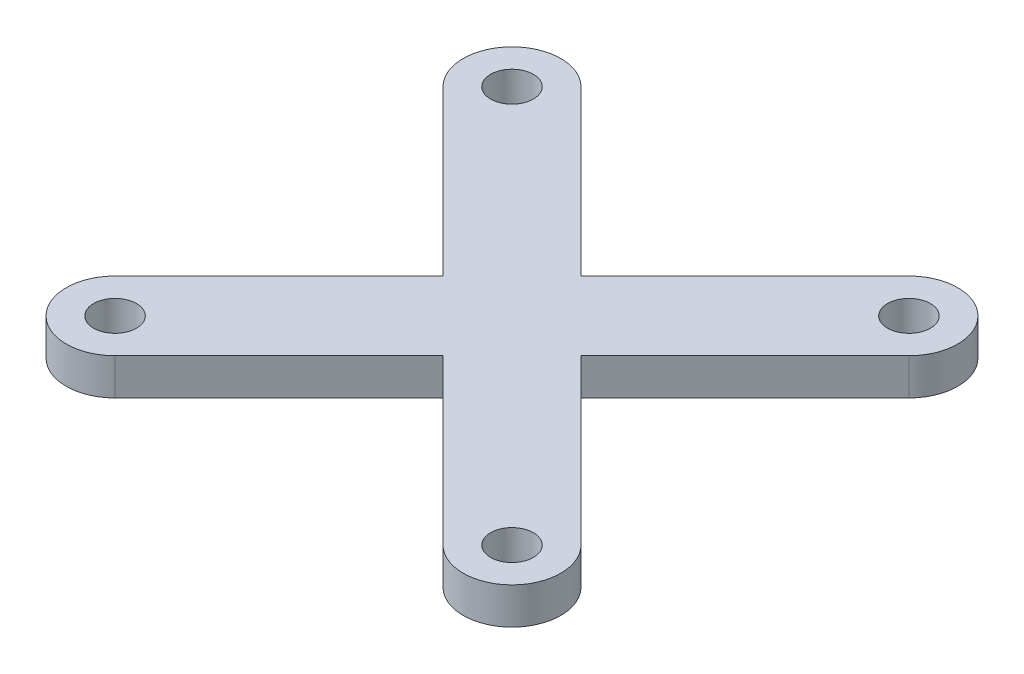
ISO-10303-21;
HEADER;
FILE_DESCRIPTION(('STEP AP214'),'2;1');
FILE_NAME('part.step','',(''),(''),'','','');
FILE_SCHEMA(('AUTOMOTIVE_DESIGN { 1 0 10303 214 1 1 1 1 }'));
ENDSEC;
DATA;
#1=APPLICATION_CONTEXT('core data for automotive mechanical design processes');
#2=APPLICATION_PROTOCOL_DEFINITION('international standard','automotive_design',2000,#1);
#3=PRODUCT_CONTEXT('',#1,'mechanical');
#4=PRODUCT('Part','Part','',(#3));
#5=PRODUCT_RELATED_PRODUCT_CATEGORY('part','',(#4));
#6=PRODUCT_DEFINITION_FORMATION('','',#4);
#7=PRODUCT_DEFINITION_CONTEXT('part definition',#1,'design');
#8=PRODUCT_DEFINITION('design','',#6,#7);
#9=PRODUCT_DEFINITION_SHAPE('','',#8);
#10=(LENGTH_UNIT() NAMED_UNIT(*) SI_UNIT(.MILLI.,.METRE.));
#11=(NAMED_UNIT(*) PLANE_ANGLE_UNIT() SI_UNIT($,.RADIAN.));
#12=(NAMED_UNIT(*) SI_UNIT($,.STERADIAN.) SOLID_ANGLE_UNIT());
#13=UNCERTAINTY_MEASURE_WITH_UNIT(LENGTH_MEASURE(1.E-05),#10,'distance_accuracy_value','');
#14=(GEOMETRIC_REPRESENTATION_CONTEXT(3) GLOBAL_UNCERTAINTY_ASSIGNED_CONTEXT((#13)) GLOBAL_UNIT_ASSIGNED_CONTEXT((#10,
#11,#12)) REPRESENTATION_CONTEXT('',''));
#15=CARTESIAN_POINT('',(0.,0.,0.));
#16=DIRECTION('',(0.,0.,1.));
#17=DIRECTION('',(1.,0.,0.));
#18=AXIS2_PLACEMENT_3D('',#15,#16,#17);
#19=CARTESIAN_POINT('',(-16.2634559672906,12.,-16.2634559672906));
#20=DIRECTION('',(0.,1.,0.));
#21=DIRECTION('',(0.,0.,1.));
#22=AXIS2_PLACEMENT_3D('',#19,#20,#21);
#23=CYLINDRICAL_SURFACE('',#22,1.755);
#24=CARTESIAN_POINT('',(-16.2634559672906,18.,-16.2634559672906));
#25=DIRECTION('',(0.,1.,0.));
#26=DIRECTION('',(0.,0.,1.));
#27=AXIS2_PLACEMENT_3D('',#24,#25,#26);
#28=CIRCLE('',#27,1.755);
#29=CARTESIAN_POINT('',(-16.2634559672906,18.,-14.5084559672906));
#30=VERTEX_POINT('',#29);
#31=EDGE_CURVE('E231',#30,#30,#28,.T.);
#32=ORIENTED_EDGE('',*,*,#31,.T.);
#33=EDGE_LOOP('',(#32));
#34=FACE_BOUND('',#33,.T.);
#35=CARTESIAN_POINT('',(-16.2634559672906,15.,-16.2634559672906));
#36=DIRECTION('',(0.,-1.,0.));
#37=DIRECTION('',(0.,0.,-1.));
#38=AXIS2_PLACEMENT_3D('',#35,#36,#37);
#39=CIRCLE('',#38,1.755);
#40=CARTESIAN_POINT('',(-16.2634559672906,15.,-18.0184559672906));
#41=VERTEX_POINT('',#40);
#42=EDGE_CURVE('E281',#41,#41,#39,.F.);
#43=ORIENTED_EDGE('',*,*,#42,.F.);
#44=EDGE_LOOP('',(#43));
#45=FACE_BOUND('',#44,.T.);
#46=ADVANCED_FACE('F41',(#34,#45),#23,.F.);
#47=CARTESIAN_POINT('',(-16.2634559672906,12.,16.2634559672909));
#48=DIRECTION('',(0.,1.,0.));
#49=DIRECTION('',(0.,0.,1.));
#50=AXIS2_PLACEMENT_3D('',#47,#48,#49);
#51=CYLINDRICAL_SURFACE('',#50,1.755);
#52=CARTESIAN_POINT('',(-16.2634559672906,18.,16.2634559672909));
#53=DIRECTION('',(0.,1.,0.));
#54=DIRECTION('',(0.,0.,1.));
#55=AXIS2_PLACEMENT_3D('',#52,#53,#54);
#56=CIRCLE('',#55,1.755);
#57=CARTESIAN_POINT('',(-16.2634559672906,18.,18.0184559672909));
#58=VERTEX_POINT('',#57);
#59=EDGE_CURVE('E283',#58,#58,#56,.T.);
#60=ORIENTED_EDGE('',*,*,#59,.T.);
#61=EDGE_LOOP('',(#60));
#62=FACE_BOUND('',#61,.T.);
#63=CARTESIAN_POINT('',(-16.2634559672906,15.,16.2634559672909));
#64=DIRECTION('',(0.,-1.,0.));
#65=DIRECTION('',(0.,0.,-1.));
#66=AXIS2_PLACEMENT_3D('',#63,#64,#65);
#67=CIRCLE('',#66,1.755);
#68=CARTESIAN_POINT('',(-16.2634559672906,15.,14.5084559672909));
#69=VERTEX_POINT('',#68);
#70=EDGE_CURVE('E284',#69,#69,#67,.F.);
#71=ORIENTED_EDGE('',*,*,#70,.F.);
#72=EDGE_LOOP('',(#71));
#73=FACE_BOUND('',#72,.T.);
#74=ADVANCED_FACE('F269',(#62,#73),#51,.F.);
#75=CARTESIAN_POINT('',(16.2634559672906,12.,-16.2634559672906));
#76=DIRECTION('',(0.,1.,0.));
#77=DIRECTION('',(0.,0.,1.));
#78=AXIS2_PLACEMENT_3D('',#75,#76,#77);
#79=CYLINDRICAL_SURFACE('',#78,1.755);
#80=CARTESIAN_POINT('',(16.2634559672906,18.,-16.2634559672906));
#81=DIRECTION('',(0.,1.,0.));
#82=DIRECTION('',(0.,0.,1.));
#83=AXIS2_PLACEMENT_3D('',#80,#81,#82);
#84=CIRCLE('',#83,1.755);
#85=CARTESIAN_POINT('',(16.2634559672906,18.,-14.5084559672906));
#86=VERTEX_POINT('',#85);
#87=EDGE_CURVE('E296',#86,#86,#84,.T.);
#88=ORIENTED_EDGE('',*,*,#87,.T.);
#89=EDGE_LOOP('',(#88));
#90=FACE_BOUND('',#89,.T.);
#91=CARTESIAN_POINT('',(16.2634559672906,15.,-16.2634559672906));
#92=DIRECTION('',(0.,-1.,0.));
#93=DIRECTION('',(0.,0.,-1.));
#94=AXIS2_PLACEMENT_3D('',#91,#92,#93);
#95=CIRCLE('',#94,1.755);
#96=CARTESIAN_POINT('',(16.2634559672906,15.,-18.0184559672906));
#97=VERTEX_POINT('',#96);
#98=EDGE_CURVE('E290',#97,#97,#95,.F.);
#99=ORIENTED_EDGE('',*,*,#98,.F.);
#100=EDGE_LOOP('',(#99));
#101=FACE_BOUND('',#100,.T.);
#102=ADVANCED_FACE('F274',(#90,#101),#79,.F.);
#103=CARTESIAN_POINT('',(16.2634559672906,12.,16.2634559672906));
#104=DIRECTION('',(0.,1.,0.));
#105=DIRECTION('',(0.,0.,1.));
#106=AXIS2_PLACEMENT_3D('',#103,#104,#105);
#107=CYLINDRICAL_SURFACE('',#106,1.755);
#108=CARTESIAN_POINT('',(16.2634559672906,18.,16.2634559672906));
#109=DIRECTION('',(0.,1.,0.));
#110=DIRECTION('',(0.,0.,1.));
#111=AXIS2_PLACEMENT_3D('',#108,#109,#110);
#112=CIRCLE('',#111,1.755);
#113=CARTESIAN_POINT('',(16.2634559672906,18.,18.0184559672906));
#114=VERTEX_POINT('',#113);
#115=EDGE_CURVE('E287',#114,#114,#112,.T.);
#116=ORIENTED_EDGE('',*,*,#115,.T.);
#117=EDGE_LOOP('',(#116));
#118=FACE_BOUND('',#117,.T.);
#119=CARTESIAN_POINT('',(16.2634559672906,15.,16.2634559672906));
#120=DIRECTION('',(0.,-1.,0.));
#121=DIRECTION('',(0.,0.,-1.));
#122=AXIS2_PLACEMENT_3D('',#119,#120,#121);
#123=CIRCLE('',#122,1.755);
#124=CARTESIAN_POINT('',(16.2634559672906,15.,14.5084559672906));
#125=VERTEX_POINT('',#124);
#126=EDGE_CURVE('E328',#125,#125,#123,.F.);
#127=ORIENTED_EDGE('',*,*,#126,.F.);
#128=EDGE_LOOP('',(#127));
#129=FACE_BOUND('',#128,.T.);
#130=ADVANCED_FACE('F312',(#118,#129),#107,.F.);
#131=CARTESIAN_POINT('',(-16.2634559672906,12.,-16.2634559672906));
#132=DIRECTION('',(0.,1.,0.));
#133=DIRECTION('',(0.,0.,1.));
#134=AXIS2_PLACEMENT_3D('',#131,#132,#133);
#135=CYLINDRICAL_SURFACE('',#134,4.);
#136=DIRECTION('',(0.,-1.,0.));
#137=VECTOR('',#136,1.);
#138=CARTESIAN_POINT('',(-13.4350288425444,18.,-19.0918830920368));
#139=LINE('',#138,#137);
#140=CARTESIAN_POINT('',(-13.4350288425444,18.,-19.0918830920368));
#141=VERTEX_POINT('',#140);
#142=CARTESIAN_POINT('',(-13.4350288425444,15.,-19.0918830920368));
#143=VERTEX_POINT('',#142);
#144=EDGE_CURVE('E151',#141,#143,#139,.T.);
#145=ORIENTED_EDGE('',*,*,#144,.T.);
#146=CARTESIAN_POINT('',(-16.2634559672906,15.,-16.2634559672906));
#147=DIRECTION('',(0.,1.,0.));
#148=DIRECTION('',(0.,0.,1.));
#149=AXIS2_PLACEMENT_3D('',#146,#147,#148);
#150=CIRCLE('',#149,3.99999999999999);
#151=CARTESIAN_POINT('',(-19.0918830920367,15.,-13.4350288425444));
#152=VERTEX_POINT('',#151);
#153=EDGE_CURVE('E58',#143,#152,#150,.T.);
#154=ORIENTED_EDGE('',*,*,#153,.T.);
#155=DIRECTION('',(0.,-1.,0.));
#156=VECTOR('',#155,1.);
#157=CARTESIAN_POINT('',(-19.0918830920367,18.,-13.4350288425444));
#158=LINE('',#157,#156);
#159=CARTESIAN_POINT('',(-19.0918830920367,18.,-13.4350288425444));
#160=VERTEX_POINT('',#159);
#161=EDGE_CURVE('E180',#160,#152,#158,.T.);
#162=ORIENTED_EDGE('',*,*,#161,.F.);
#163=CARTESIAN_POINT('',(-16.2634559672906,18.,-16.2634559672906));
#164=DIRECTION('',(0.,1.,0.));
#165=DIRECTION('',(0.,0.,1.));
#166=AXIS2_PLACEMENT_3D('',#163,#164,#165);
#167=CIRCLE('',#166,3.99999999999999);
#168=EDGE_CURVE('E138',#141,#160,#167,.T.);
#169=ORIENTED_EDGE('',*,*,#168,.F.);
#170=EDGE_LOOP('',(#145,#154,#162,#169));
#171=FACE_BOUND('',#170,.T.);
#172=ADVANCED_FACE('F266',(#171),#135,.T.);
#173=CARTESIAN_POINT('',(16.2634559672906,12.,-16.2634559672906));
#174=DIRECTION('',(0.,1.,0.));
#175=DIRECTION('',(0.,0.,1.));
#176=AXIS2_PLACEMENT_3D('',#173,#174,#175);
#177=CYLINDRICAL_SURFACE('',#176,4.);
#178=DIRECTION('',(0.,-1.,0.));
#179=VECTOR('',#178,1.);
#180=CARTESIAN_POINT('',(19.0918830920369,18.,-13.4350288425443));
#181=LINE('',#180,#179);
#182=CARTESIAN_POINT('',(19.0918830920369,18.,-13.4350288425443));
#183=VERTEX_POINT('',#182);
#184=CARTESIAN_POINT('',(19.0918830920369,15.,-13.4350288425443));
#185=VERTEX_POINT('',#184);
#186=EDGE_CURVE('E153',#183,#185,#181,.T.);
#187=ORIENTED_EDGE('',*,*,#186,.T.);
#188=CARTESIAN_POINT('',(16.2634559672906,15.,-16.2634559672906));
#189=DIRECTION('',(0.,1.,0.));
#190=DIRECTION('',(0.,0.,-1.));
#191=AXIS2_PLACEMENT_3D('',#188,#189,#190);
#192=CIRCLE('',#191,4.00000000000013);
#193=CARTESIAN_POINT('',(13.4350288425443,15.,-19.0918830920369));
#194=VERTEX_POINT('',#193);
#195=EDGE_CURVE('E12',#185,#194,#192,.T.);
#196=ORIENTED_EDGE('',*,*,#195,.T.);
#197=DIRECTION('',(0.,-1.,0.));
#198=VECTOR('',#197,1.);
#199=CARTESIAN_POINT('',(13.4350288425443,18.,-19.0918830920369));
#200=LINE('',#199,#198);
#201=CARTESIAN_POINT('',(13.4350288425443,18.,-19.0918830920369));
#202=VERTEX_POINT('',#201);
#203=EDGE_CURVE('E147',#202,#194,#200,.T.);
#204=ORIENTED_EDGE('',*,*,#203,.F.);
#205=CARTESIAN_POINT('',(16.2634559672906,18.,-16.2634559672906));
#206=DIRECTION('',(0.,1.,0.));
#207=DIRECTION('',(0.,0.,-1.));
#208=AXIS2_PLACEMENT_3D('',#205,#206,#207);
#209=CIRCLE('',#208,4.00000000000013);
#210=EDGE_CURVE('E222',#183,#202,#209,.T.);
#211=ORIENTED_EDGE('',*,*,#210,.F.);
#212=EDGE_LOOP('',(#187,#196,#204,#211));
#213=FACE_BOUND('',#212,.T.);
#214=ADVANCED_FACE('F248',(#213),#177,.T.);
#215=CARTESIAN_POINT('',(16.2634559672906,12.,16.2634559672906));
#216=DIRECTION('',(0.,1.,0.));
#217=DIRECTION('',(0.,0.,1.));
#218=AXIS2_PLACEMENT_3D('',#215,#216,#217);
#219=CYLINDRICAL_SURFACE('',#218,4.);
#220=DIRECTION('',(0.,-1.,0.));
#221=VECTOR('',#220,1.);
#222=CARTESIAN_POINT('',(13.4350288425448,18.,19.0918830920365));
#223=LINE('',#222,#221);
#224=CARTESIAN_POINT('',(13.4350288425448,18.,19.0918830920365));
#225=VERTEX_POINT('',#224);
#226=CARTESIAN_POINT('',(13.4350288425448,15.,19.0918830920365));
#227=VERTEX_POINT('',#226);
#228=EDGE_CURVE('E165',#225,#227,#223,.T.);
#229=ORIENTED_EDGE('',*,*,#228,.T.);
#230=CARTESIAN_POINT('',(16.2634559672906,15.,16.2634559672906));
#231=DIRECTION('',(0.,1.,0.));
#232=DIRECTION('',(0.,0.,-1.));
#233=AXIS2_PLACEMENT_3D('',#230,#231,#232);
#234=CIRCLE('',#233,3.99999999999951);
#235=CARTESIAN_POINT('',(19.0918830920364,15.,13.4350288425447));
#236=VERTEX_POINT('',#235);
#237=EDGE_CURVE('E50',#227,#236,#234,.T.);
#238=ORIENTED_EDGE('',*,*,#237,.T.);
#239=DIRECTION('',(0.,-1.,0.));
#240=VECTOR('',#239,1.);
#241=CARTESIAN_POINT('',(19.0918830920364,18.,13.4350288425447));
#242=LINE('',#241,#240);
#243=CARTESIAN_POINT('',(19.0918830920364,18.,13.4350288425447));
#244=VERTEX_POINT('',#243);
#245=EDGE_CURVE('E162',#244,#236,#242,.T.);
#246=ORIENTED_EDGE('',*,*,#245,.F.);
#247=CARTESIAN_POINT('',(16.2634559672906,18.,16.2634559672906));
#248=DIRECTION('',(0.,1.,0.));
#249=DIRECTION('',(0.,0.,-1.));
#250=AXIS2_PLACEMENT_3D('',#247,#248,#249);
#251=CIRCLE('',#250,3.99999999999951);
#252=EDGE_CURVE('E211',#225,#244,#251,.T.);
#253=ORIENTED_EDGE('',*,*,#252,.F.);
#254=EDGE_LOOP('',(#229,#238,#246,#253));
#255=FACE_BOUND('',#254,.T.);
#256=ADVANCED_FACE('F258',(#255),#219,.T.);
#257=CARTESIAN_POINT('',(-16.2634559672906,12.,16.2634559672909));
#258=DIRECTION('',(0.,1.,0.));
#259=DIRECTION('',(0.,0.,1.));
#260=AXIS2_PLACEMENT_3D('',#257,#258,#259);
#261=CYLINDRICAL_SURFACE('',#260,4.);
#262=DIRECTION('',(0.,-1.,0.));
#263=VECTOR('',#262,1.);
#264=CARTESIAN_POINT('',(-19.0918830920367,18.,13.4350288425447));
#265=LINE('',#264,#263);
#266=CARTESIAN_POINT('',(-19.0918830920367,18.,13.4350288425447));
#267=VERTEX_POINT('',#266);
#268=CARTESIAN_POINT('',(-19.0918830920368,15.,13.4350288425447));
#269=VERTEX_POINT('',#268);
#270=EDGE_CURVE('E174',#267,#269,#265,.T.);
#271=ORIENTED_EDGE('',*,*,#270,.T.);
#272=CARTESIAN_POINT('',(-16.2634559672906,15.,16.2634559672909));
#273=DIRECTION('',(0.,1.,0.));
#274=DIRECTION('',(0.,0.,1.));
#275=AXIS2_PLACEMENT_3D('',#272,#273,#274);
#276=CIRCLE('',#275,3.99999999999993);
#277=CARTESIAN_POINT('',(-13.4350288425444,15.,19.091883092037));
#278=VERTEX_POINT('',#277);
#279=EDGE_CURVE('E44',#269,#278,#276,.T.);
#280=ORIENTED_EDGE('',*,*,#279,.T.);
#281=DIRECTION('',(0.,-1.,0.));
#282=VECTOR('',#281,1.);
#283=CARTESIAN_POINT('',(-13.4350288425444,18.,19.091883092037));
#284=LINE('',#283,#282);
#285=CARTESIAN_POINT('',(-13.4350288425444,18.,19.091883092037));
#286=VERTEX_POINT('',#285);
#287=EDGE_CURVE('E171',#286,#278,#284,.T.);
#288=ORIENTED_EDGE('',*,*,#287,.F.);
#289=CARTESIAN_POINT('',(-16.2634559672906,18.,16.2634559672909));
#290=DIRECTION('',(0.,1.,0.));
#291=DIRECTION('',(0.,0.,1.));
#292=AXIS2_PLACEMENT_3D('',#289,#290,#291);
#293=CIRCLE('',#292,3.99999999999993);
#294=EDGE_CURVE('E209',#267,#286,#293,.T.);
#295=ORIENTED_EDGE('',*,*,#294,.F.);
#296=EDGE_LOOP('',(#271,#280,#288,#295));
#297=FACE_BOUND('',#296,.T.);
#298=ADVANCED_FACE('F196',(#297),#261,.T.);
#299=CARTESIAN_POINT('',(-16.2634559672906,18.,-16.2634559672906));
#300=DIRECTION('',(0.,1.,0.));
#301=DIRECTION('',(0.,0.,1.));
#302=AXIS2_PLACEMENT_3D('',#299,#300,#301);
#303=PLANE('',#302);
#304=ORIENTED_EDGE('',*,*,#115,.F.);
#305=EDGE_LOOP('',(#304));
#306=FACE_BOUND('',#305,.T.);
#307=ORIENTED_EDGE('',*,*,#31,.F.);
#308=EDGE_LOOP('',(#307));
#309=FACE_BOUND('',#308,.T.);
#310=ORIENTED_EDGE('',*,*,#168,.T.);
#311=DIRECTION('',(0.707106781186555,0.,0.70710678118654));
#312=VECTOR('',#311,1.);
#313=CARTESIAN_POINT('',(-19.0918830920367,18.,-13.4350288425444));
#314=LINE('',#313,#312);
#315=CARTESIAN_POINT('',(-5.65685424949216,18.,0.));
#316=VERTEX_POINT('',#315);
#317=EDGE_CURVE('E301',#160,#316,#314,.T.);
#318=ORIENTED_EDGE('',*,*,#317,.T.);
#319=DIRECTION('',(-0.707106781186542,0.,0.707106781186554));
#320=VECTOR('',#319,1.);
#321=CARTESIAN_POINT('',(-5.65685424949216,18.,0.));
#322=LINE('',#321,#320);
#323=EDGE_CURVE('E213',#316,#267,#322,.T.);
#324=ORIENTED_EDGE('',*,*,#323,.T.);
#325=ORIENTED_EDGE('',*,*,#294,.T.);
#326=DIRECTION('',(0.707106781186548,0.,-0.707106781186547));
#327=VECTOR('',#326,1.);
#328=CARTESIAN_POINT('',(-13.4350288425444,18.,19.091883092037));
#329=LINE('',#328,#327);
#330=CARTESIAN_POINT('',(3.00974523081976E-13,18.,5.65685424949227));
#331=VERTEX_POINT('',#330);
#332=EDGE_CURVE('E206',#286,#331,#329,.T.);
#333=ORIENTED_EDGE('',*,*,#332,.T.);
#334=DIRECTION('',(0.707106781186555,0.,0.70710678118654));
#335=VECTOR('',#334,1.);
#336=CARTESIAN_POINT('',(3.00974523081976E-13,18.,5.65685424949227));
#337=LINE('',#336,#335);
#338=EDGE_CURVE('E208',#331,#225,#337,.T.);
#339=ORIENTED_EDGE('',*,*,#338,.T.);
#340=ORIENTED_EDGE('',*,*,#252,.T.);
#341=DIRECTION('',(-0.70710678118653,0.,-0.707106781186565));
#342=VECTOR('',#341,1.);
#343=CARTESIAN_POINT('',(5.65685424949258,18.,2.18575157973078E-13));
#344=LINE('',#343,#342);
#345=CARTESIAN_POINT('',(5.65685424949258,18.,2.18575157973078E-13));
#346=VERTEX_POINT('',#345);
#347=EDGE_CURVE('E218',#244,#346,#344,.T.);
#348=ORIENTED_EDGE('',*,*,#347,.T.);
#349=DIRECTION('',(0.707106781186541,0.,-0.707106781186554));
#350=VECTOR('',#349,1.);
#351=CARTESIAN_POINT('',(19.0918830920369,18.,-13.4350288425443));
#352=LINE('',#351,#350);
#353=EDGE_CURVE('E220',#346,#183,#352,.T.);
#354=ORIENTED_EDGE('',*,*,#353,.T.);
#355=ORIENTED_EDGE('',*,*,#210,.T.);
#356=DIRECTION('',(-0.707106781186541,0.,0.707106781186554));
#357=VECTOR('',#356,1.);
#358=CARTESIAN_POINT('',(-1.27502175484295E-13,18.,-5.65685424949221));
#359=LINE('',#358,#357);
#360=CARTESIAN_POINT('',(-1.27502175484295E-13,18.,-5.65685424949221));
#361=VERTEX_POINT('',#360);
#362=EDGE_CURVE('E224',#202,#361,#359,.T.);
#363=ORIENTED_EDGE('',*,*,#362,.T.);
#364=DIRECTION('',(-0.70710678118654,0.,-0.707106781186555));
#365=VECTOR('',#364,1.);
#366=CARTESIAN_POINT('',(-13.4350288425444,18.,-19.0918830920368));
#367=LINE('',#366,#365);
#368=EDGE_CURVE('E66',#361,#141,#367,.T.);
#369=ORIENTED_EDGE('',*,*,#368,.T.);
#370=EDGE_LOOP('',(#310,#318,#324,#325,#333,#339,#340,#348,#354,#355,#363,#369));
#371=FACE_BOUND('',#370,.T.);
#372=ORIENTED_EDGE('',*,*,#87,.F.);
#373=EDGE_LOOP('',(#372));
#374=FACE_BOUND('',#373,.T.);
#375=ORIENTED_EDGE('',*,*,#59,.F.);
#376=EDGE_LOOP('',(#375));
#377=FACE_BOUND('',#376,.T.);
#378=ADVANCED_FACE('F249',(#306,#309,#371,#374,#377),#303,.T.);
#379=CARTESIAN_POINT('',(-19.0918830920367,18.,-13.4350288425444));
#380=DIRECTION('',(0.70710678118654,0.,-0.707106781186555));
#381=DIRECTION('',(-0.707106781186555,0.,-0.70710678118654));
#382=AXIS2_PLACEMENT_3D('',#379,#380,#381);
#383=PLANE('',#382);
#384=DIRECTION('',(0.707106781186555,0.,0.70710678118654));
#385=VECTOR('',#384,1.);
#386=CARTESIAN_POINT('',(-19.0918830920367,15.,-13.4350288425444));
#387=LINE('',#386,#385);
#388=CARTESIAN_POINT('',(-5.65685424949216,15.,0.));
#389=VERTEX_POINT('',#388);
#390=EDGE_CURVE('E227',#152,#389,#387,.T.);
#391=ORIENTED_EDGE('',*,*,#390,.T.);
#392=DIRECTION('',(0.,-1.,0.));
#393=VECTOR('',#392,1.);
#394=CARTESIAN_POINT('',(-5.65685424949216,18.,0.));
#395=LINE('',#394,#393);
#396=EDGE_CURVE('E177',#316,#389,#395,.T.);
#397=ORIENTED_EDGE('',*,*,#396,.F.);
#398=ORIENTED_EDGE('',*,*,#317,.F.);
#399=ORIENTED_EDGE('',*,*,#161,.T.);
#400=EDGE_LOOP('',(#391,#397,#398,#399));
#401=FACE_BOUND('',#400,.T.);
#402=ADVANCED_FACE('F307',(#401),#383,.F.);
#403=CARTESIAN_POINT('',(-5.65685424949216,18.,0.));
#404=DIRECTION('',(0.707106781186553,0.,0.707106781186541));
#405=DIRECTION('',(0.707106781186542,0.,-0.707106781186554));
#406=AXIS2_PLACEMENT_3D('',#403,#404,#405);
#407=PLANE('',#406);
#408=DIRECTION('',(-0.707106781186542,0.,0.707106781186554));
#409=VECTOR('',#408,1.);
#410=CARTESIAN_POINT('',(-5.65685424949216,15.,0.));
#411=LINE('',#410,#409);
#412=EDGE_CURVE('E230',#389,#269,#411,.T.);
#413=ORIENTED_EDGE('',*,*,#412,.T.);
#414=ORIENTED_EDGE('',*,*,#270,.F.);
#415=ORIENTED_EDGE('',*,*,#323,.F.);
#416=ORIENTED_EDGE('',*,*,#396,.T.);
#417=EDGE_LOOP('',(#413,#414,#415,#416));
#418=FACE_BOUND('',#417,.T.);
#419=ADVANCED_FACE('F305',(#418),#407,.F.);
#420=CARTESIAN_POINT('',(-13.4350288425444,18.,19.091883092037));
#421=DIRECTION('',(-0.707106781186547,0.,-0.707106781186548));
#422=DIRECTION('',(-0.707106781186548,0.,0.707106781186547));
#423=AXIS2_PLACEMENT_3D('',#420,#421,#422);
#424=PLANE('',#423);
#425=DIRECTION('',(0.707106781186548,0.,-0.707106781186547));
#426=VECTOR('',#425,1.);
#427=CARTESIAN_POINT('',(-13.4350288425444,15.,19.091883092037));
#428=LINE('',#427,#426);
#429=CARTESIAN_POINT('',(3.01271458304254E-13,15.,5.65685424949227));
#430=VERTEX_POINT('',#429);
#431=EDGE_CURVE('E205',#278,#430,#428,.T.);
#432=ORIENTED_EDGE('',*,*,#431,.T.);
#433=DIRECTION('',(0.,-1.,0.));
#434=VECTOR('',#433,1.);
#435=CARTESIAN_POINT('',(3.00974523081976E-13,18.,5.65685424949227));
#436=LINE('',#435,#434);
#437=EDGE_CURVE('E168',#331,#430,#436,.T.);
#438=ORIENTED_EDGE('',*,*,#437,.F.);
#439=ORIENTED_EDGE('',*,*,#332,.F.);
#440=ORIENTED_EDGE('',*,*,#287,.T.);
#441=EDGE_LOOP('',(#432,#438,#439,#440));
#442=FACE_BOUND('',#441,.T.);
#443=ADVANCED_FACE('F203',(#442),#424,.F.);
#444=CARTESIAN_POINT('',(3.00974523081976E-13,18.,5.65685424949227));
#445=DIRECTION('',(0.70710678118654,0.,-0.707106781186555));
#446=DIRECTION('',(-0.707106781186555,0.,-0.70710678118654));
#447=AXIS2_PLACEMENT_3D('',#444,#445,#446);
#448=PLANE('',#447);
#449=DIRECTION('',(0.707106781186555,0.,0.70710678118654));
#450=VECTOR('',#449,1.);
#451=CARTESIAN_POINT('',(3.00974523081976E-13,15.,5.65685424949227));
#452=LINE('',#451,#450);
#453=EDGE_CURVE('E234',#430,#227,#452,.T.);
#454=ORIENTED_EDGE('',*,*,#453,.T.);
#455=ORIENTED_EDGE('',*,*,#228,.F.);
#456=ORIENTED_EDGE('',*,*,#338,.F.);
#457=ORIENTED_EDGE('',*,*,#437,.T.);
#458=EDGE_LOOP('',(#454,#455,#456,#457));
#459=FACE_BOUND('',#458,.T.);
#460=ADVANCED_FACE('F257',(#459),#448,.F.);
#461=CARTESIAN_POINT('',(5.65685424949258,18.,2.18575157973078E-13));
#462=DIRECTION('',(-0.707106781186565,0.,0.70710678118653));
#463=DIRECTION('',(0.70710678118653,0.,0.707106781186565));
#464=AXIS2_PLACEMENT_3D('',#461,#462,#463);
#465=PLANE('',#464);
#466=DIRECTION('',(-0.70710678118653,0.,-0.707106781186565));
#467=VECTOR('',#466,1.);
#468=CARTESIAN_POINT('',(5.65685424949258,15.,2.18575157973078E-13));
#469=LINE('',#468,#467);
#470=CARTESIAN_POINT('',(5.65685424949258,15.,2.16840434497101E-13));
#471=VERTEX_POINT('',#470);
#472=EDGE_CURVE('E237',#236,#471,#469,.T.);
#473=ORIENTED_EDGE('',*,*,#472,.T.);
#474=DIRECTION('',(0.,-1.,0.));
#475=VECTOR('',#474,1.);
#476=CARTESIAN_POINT('',(5.65685424949258,18.,2.18575157973078E-13));
#477=LINE('',#476,#475);
#478=EDGE_CURVE('E159',#346,#471,#477,.T.);
#479=ORIENTED_EDGE('',*,*,#478,.F.);
#480=ORIENTED_EDGE('',*,*,#347,.F.);
#481=ORIENTED_EDGE('',*,*,#245,.T.);
#482=EDGE_LOOP('',(#473,#479,#480,#481));
#483=FACE_BOUND('',#482,.T.);
#484=ADVANCED_FACE('F254',(#483),#465,.F.);
#485=CARTESIAN_POINT('',(19.0918830920369,18.,-13.4350288425443));
#486=DIRECTION('',(-0.707106781186553,0.,-0.707106781186541));
#487=DIRECTION('',(-0.707106781186542,0.,0.707106781186554));
#488=AXIS2_PLACEMENT_3D('',#485,#486,#487);
#489=PLANE('',#488);
#490=DIRECTION('',(0.707106781186541,0.,-0.707106781186554));
#491=VECTOR('',#490,1.);
#492=CARTESIAN_POINT('',(19.0918830920369,15.,-13.4350288425443));
#493=LINE('',#492,#491);
#494=EDGE_CURVE('E148',#471,#185,#493,.T.);
#495=ORIENTED_EDGE('',*,*,#494,.T.);
#496=ORIENTED_EDGE('',*,*,#186,.F.);
#497=ORIENTED_EDGE('',*,*,#353,.F.);
#498=ORIENTED_EDGE('',*,*,#478,.T.);
#499=EDGE_LOOP('',(#495,#496,#497,#498));
#500=FACE_BOUND('',#499,.T.);
#501=ADVANCED_FACE('F243',(#500),#489,.F.);
#502=CARTESIAN_POINT('',(-1.27502175484295E-13,18.,-5.65685424949221));
#503=DIRECTION('',(0.707106781186554,0.,0.707106781186541));
#504=DIRECTION('',(0.707106781186541,0.,-0.707106781186554));
#505=AXIS2_PLACEMENT_3D('',#502,#503,#504);
#506=PLANE('',#505);
#507=DIRECTION('',(-0.707106781186541,0.,0.707106781186554));
#508=VECTOR('',#507,1.);
#509=CARTESIAN_POINT('',(-1.27502175484295E-13,15.,-5.65685424949221));
#510=LINE('',#509,#508);
#511=CARTESIAN_POINT('',(-1.28369537222284E-13,15.,-5.65685424949221));
#512=VERTEX_POINT('',#511);
#513=EDGE_CURVE('E134',#194,#512,#510,.T.);
#514=ORIENTED_EDGE('',*,*,#513,.T.);
#515=DIRECTION('',(0.,-1.,0.));
#516=VECTOR('',#515,1.);
#517=CARTESIAN_POINT('',(-1.27502175484295E-13,18.,-5.65685424949221));
#518=LINE('',#517,#516);
#519=EDGE_CURVE('E145',#361,#512,#518,.T.);
#520=ORIENTED_EDGE('',*,*,#519,.F.);
#521=ORIENTED_EDGE('',*,*,#362,.F.);
#522=ORIENTED_EDGE('',*,*,#203,.T.);
#523=EDGE_LOOP('',(#514,#520,#521,#522));
#524=FACE_BOUND('',#523,.T.);
#525=ADVANCED_FACE('F143',(#524),#506,.F.);
#526=CARTESIAN_POINT('',(-13.4350288425444,18.,-19.0918830920368));
#527=DIRECTION('',(-0.707106781186555,0.,0.70710678118654));
#528=DIRECTION('',(0.70710678118654,0.,0.707106781186555));
#529=AXIS2_PLACEMENT_3D('',#526,#527,#528);
#530=PLANE('',#529);
#531=DIRECTION('',(-0.70710678118654,0.,-0.707106781186555));
#532=VECTOR('',#531,1.);
#533=CARTESIAN_POINT('',(-13.4350288425444,15.,-19.0918830920368));
#534=LINE('',#533,#532);
#535=EDGE_CURVE('E130',#512,#143,#534,.T.);
#536=ORIENTED_EDGE('',*,*,#535,.T.);
#537=ORIENTED_EDGE('',*,*,#144,.F.);
#538=ORIENTED_EDGE('',*,*,#368,.F.);
#539=ORIENTED_EDGE('',*,*,#519,.T.);
#540=EDGE_LOOP('',(#536,#537,#538,#539));
#541=FACE_BOUND('',#540,.T.);
#542=ADVANCED_FACE('F150',(#541),#530,.F.);
#543=CARTESIAN_POINT('',(-23.2567496769519,15.,36.2634559672907));
#544=DIRECTION('',(0.,-1.,0.));
#545=DIRECTION('',(0.,0.,-1.));
#546=AXIS2_PLACEMENT_3D('',#543,#544,#545);
#547=PLANE('',#546);
#548=ORIENTED_EDGE('',*,*,#70,.T.);
#549=EDGE_LOOP('',(#548));
#550=FACE_BOUND('',#549,.T.);
#551=ORIENTED_EDGE('',*,*,#126,.T.);
#552=EDGE_LOOP('',(#551));
#553=FACE_BOUND('',#552,.T.);
#554=ORIENTED_EDGE('',*,*,#153,.F.);
#555=ORIENTED_EDGE('',*,*,#535,.F.);
#556=ORIENTED_EDGE('',*,*,#513,.F.);
#557=ORIENTED_EDGE('',*,*,#195,.F.);
#558=ORIENTED_EDGE('',*,*,#494,.F.);
#559=ORIENTED_EDGE('',*,*,#472,.F.);
#560=ORIENTED_EDGE('',*,*,#237,.F.);
#561=ORIENTED_EDGE('',*,*,#453,.F.);
#562=ORIENTED_EDGE('',*,*,#431,.F.);
#563=ORIENTED_EDGE('',*,*,#279,.F.);
#564=ORIENTED_EDGE('',*,*,#412,.F.);
#565=ORIENTED_EDGE('',*,*,#390,.F.);
#566=EDGE_LOOP('',(#554,#555,#556,#557,#558,#559,#560,#561,#562,#563,#564,#565));
#567=FACE_BOUND('',#566,.T.);
#568=ORIENTED_EDGE('',*,*,#98,.T.);
#569=EDGE_LOOP('',(#568));
#570=FACE_BOUND('',#569,.T.);
#571=ORIENTED_EDGE('',*,*,#42,.T.);
#572=EDGE_LOOP('',(#571));
#573=FACE_BOUND('',#572,.T.);
#574=ADVANCED_FACE('F132',(#550,#553,#567,#570,#573),#547,.T.);
#575=CLOSED_SHELL('',(#46,#74,#102,#130,#172,#214,#256,#298,#378,#402,#419,#443,#460,#484,#501,
#525,#542,#574));
#576=MANIFOLD_SOLID_BREP('B2',#575);
#577=ADVANCED_BREP_SHAPE_REPRESENTATION('',(#18,#576),#14);
#578=SHAPE_DEFINITION_REPRESENTATION(#9,#577);
ENDSEC;
END-ISO-10303-21;
